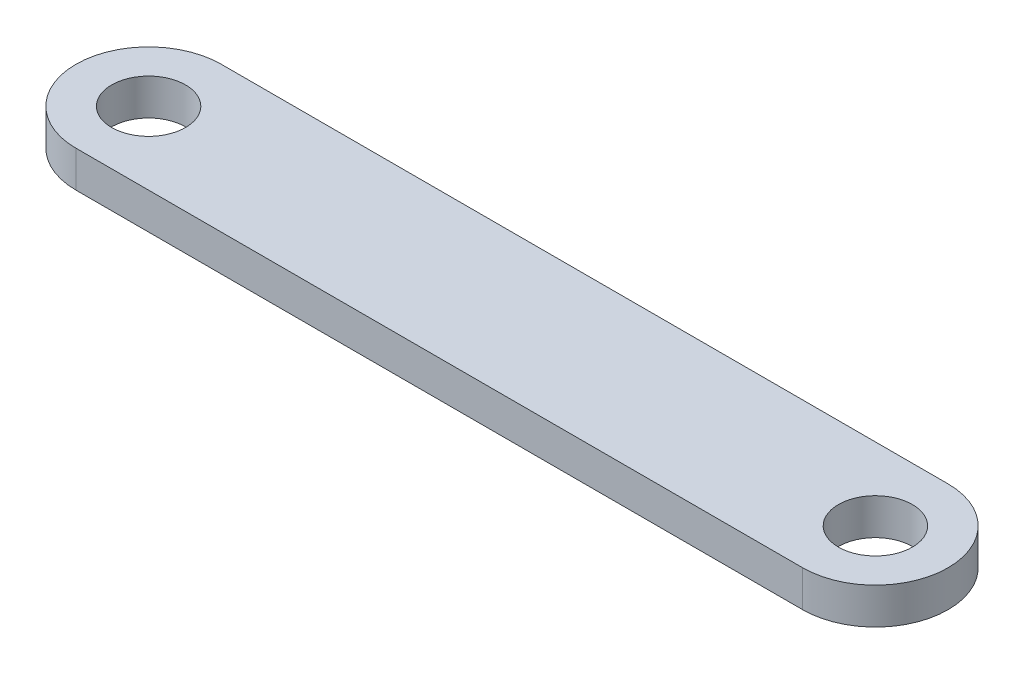
ISO-10303-21;
HEADER;
FILE_DESCRIPTION(('STEP AP214'),'2;1');
FILE_NAME('part.step','',(''),(''),'','','');
FILE_SCHEMA(('AUTOMOTIVE_DESIGN { 1 0 10303 214 1 1 1 1 }'));
ENDSEC;
DATA;
#1=APPLICATION_CONTEXT('core data for automotive mechanical design processes');
#2=APPLICATION_PROTOCOL_DEFINITION('international standard','automotive_design',2000,#1);
#3=PRODUCT_CONTEXT('',#1,'mechanical');
#4=PRODUCT('Part','Part','',(#3));
#5=PRODUCT_RELATED_PRODUCT_CATEGORY('part','',(#4));
#6=PRODUCT_DEFINITION_FORMATION('','',#4);
#7=PRODUCT_DEFINITION_CONTEXT('part definition',#1,'design');
#8=PRODUCT_DEFINITION('design','',#6,#7);
#9=PRODUCT_DEFINITION_SHAPE('','',#8);
#10=(LENGTH_UNIT() NAMED_UNIT(*) SI_UNIT(.MILLI.,.METRE.));
#11=(NAMED_UNIT(*) PLANE_ANGLE_UNIT() SI_UNIT($,.RADIAN.));
#12=(NAMED_UNIT(*) SI_UNIT($,.STERADIAN.) SOLID_ANGLE_UNIT());
#13=UNCERTAINTY_MEASURE_WITH_UNIT(LENGTH_MEASURE(1.E-05),#10,'distance_accuracy_value','');
#14=(GEOMETRIC_REPRESENTATION_CONTEXT(3) GLOBAL_UNCERTAINTY_ASSIGNED_CONTEXT((#13)) GLOBAL_UNIT_ASSIGNED_CONTEXT((#10,
#11,#12)) REPRESENTATION_CONTEXT('',''));
#15=CARTESIAN_POINT('',(0.,0.,0.));
#16=DIRECTION('',(0.,0.,1.));
#17=DIRECTION('',(1.,0.,0.));
#18=AXIS2_PLACEMENT_3D('',#15,#16,#17);
#19=CARTESIAN_POINT('',(0.,3.,0.));
#20=DIRECTION('',(0.,1.,0.));
#21=DIRECTION('',(0.,0.,1.));
#22=AXIS2_PLACEMENT_3D('',#19,#20,#21);
#23=PLANE('',#22);
#24=CARTESIAN_POINT('',(0.,3.,0.));
#25=DIRECTION('',(0.,1.,0.));
#26=DIRECTION('',(0.,0.,1.));
#27=AXIS2_PLACEMENT_3D('',#24,#25,#26);
#28=CIRCLE('',#27,3.05);
#29=CARTESIAN_POINT('',(0.,3.,3.05));
#30=VERTEX_POINT('',#29);
#31=EDGE_CURVE('E108',#30,#30,#28,.T.);
#32=ORIENTED_EDGE('',*,*,#31,.F.);
#33=EDGE_LOOP('',(#32));
#34=FACE_BOUND('',#33,.T.);
#35=CARTESIAN_POINT('',(0.,3.,0.));
#36=DIRECTION('',(0.,1.,0.));
#37=DIRECTION('',(0.,0.,1.));
#38=AXIS2_PLACEMENT_3D('',#35,#36,#37);
#39=CIRCLE('',#38,6.);
#40=CARTESIAN_POINT('',(0.,3.,-6.));
#41=VERTEX_POINT('',#40);
#42=CARTESIAN_POINT('',(0.,3.,6.));
#43=VERTEX_POINT('',#42);
#44=EDGE_CURVE('E93',#41,#43,#39,.T.);
#45=ORIENTED_EDGE('',*,*,#44,.T.);
#46=DIRECTION('',(1.,0.,0.));
#47=VECTOR('',#46,1.);
#48=CARTESIAN_POINT('',(0.,3.,6.));
#49=LINE('',#48,#47);
#50=CARTESIAN_POINT('',(60.,3.,6.));
#51=VERTEX_POINT('',#50);
#52=EDGE_CURVE('E88',#43,#51,#49,.T.);
#53=ORIENTED_EDGE('',*,*,#52,.T.);
#54=CARTESIAN_POINT('',(60.,3.,0.));
#55=DIRECTION('',(0.,1.,0.));
#56=DIRECTION('',(0.,0.,1.));
#57=AXIS2_PLACEMENT_3D('',#54,#55,#56);
#58=CIRCLE('',#57,6.);
#59=CARTESIAN_POINT('',(60.,3.,-6.));
#60=VERTEX_POINT('',#59);
#61=EDGE_CURVE('E91',#51,#60,#58,.T.);
#62=ORIENTED_EDGE('',*,*,#61,.T.);
#63=DIRECTION('',(-1.,0.,0.));
#64=VECTOR('',#63,1.);
#65=CARTESIAN_POINT('',(0.,3.,-6.));
#66=LINE('',#65,#64);
#67=EDGE_CURVE('E58',#60,#41,#66,.T.);
#68=ORIENTED_EDGE('',*,*,#67,.T.);
#69=EDGE_LOOP('',(#45,#53,#62,#68));
#70=FACE_BOUND('',#69,.T.);
#71=CARTESIAN_POINT('',(60.,3.,0.));
#72=DIRECTION('',(0.,1.,0.));
#73=DIRECTION('',(0.,0.,1.));
#74=AXIS2_PLACEMENT_3D('',#71,#72,#73);
#75=CIRCLE('',#74,3.04999999999999);
#76=CARTESIAN_POINT('',(60.,3.,3.04999999999999));
#77=VERTEX_POINT('',#76);
#78=EDGE_CURVE('E123',#77,#77,#75,.T.);
#79=ORIENTED_EDGE('',*,*,#78,.F.);
#80=EDGE_LOOP('',(#79));
#81=FACE_BOUND('',#80,.T.);
#82=ADVANCED_FACE('F41',(#34,#70,#81),#23,.T.);
#83=CARTESIAN_POINT('',(0.,0.,0.));
#84=DIRECTION('',(0.,1.,0.));
#85=DIRECTION('',(0.,0.,1.));
#86=AXIS2_PLACEMENT_3D('',#83,#84,#85);
#87=PLANE('',#86);
#88=CARTESIAN_POINT('',(0.,0.,0.));
#89=DIRECTION('',(0.,1.,0.));
#90=DIRECTION('',(0.,0.,1.));
#91=AXIS2_PLACEMENT_3D('',#88,#89,#90);
#92=CIRCLE('',#91,6.);
#93=CARTESIAN_POINT('',(0.,0.,-6.));
#94=VERTEX_POINT('',#93);
#95=CARTESIAN_POINT('',(0.,0.,6.));
#96=VERTEX_POINT('',#95);
#97=EDGE_CURVE('E105',#94,#96,#92,.T.);
#98=ORIENTED_EDGE('',*,*,#97,.F.);
#99=DIRECTION('',(-1.,0.,0.));
#100=VECTOR('',#99,1.);
#101=CARTESIAN_POINT('',(0.,0.,-6.));
#102=LINE('',#101,#100);
#103=CARTESIAN_POINT('',(60.,0.,-6.));
#104=VERTEX_POINT('',#103);
#105=EDGE_CURVE('E81',#104,#94,#102,.T.);
#106=ORIENTED_EDGE('',*,*,#105,.F.);
#107=CARTESIAN_POINT('',(60.,0.,0.));
#108=DIRECTION('',(0.,1.,0.));
#109=DIRECTION('',(0.,0.,1.));
#110=AXIS2_PLACEMENT_3D('',#107,#108,#109);
#111=CIRCLE('',#110,6.);
#112=CARTESIAN_POINT('',(60.,0.,6.));
#113=VERTEX_POINT('',#112);
#114=EDGE_CURVE('E75',#113,#104,#111,.T.);
#115=ORIENTED_EDGE('',*,*,#114,.F.);
#116=DIRECTION('',(1.,0.,0.));
#117=VECTOR('',#116,1.);
#118=CARTESIAN_POINT('',(0.,0.,6.));
#119=LINE('',#118,#117);
#120=EDGE_CURVE('E97',#96,#113,#119,.T.);
#121=ORIENTED_EDGE('',*,*,#120,.F.);
#122=EDGE_LOOP('',(#98,#106,#115,#121));
#123=FACE_BOUND('',#122,.T.);
#124=CARTESIAN_POINT('',(0.,0.,0.));
#125=DIRECTION('',(0.,1.,0.));
#126=DIRECTION('',(0.,0.,1.));
#127=AXIS2_PLACEMENT_3D('',#124,#125,#126);
#128=CIRCLE('',#127,3.05);
#129=CARTESIAN_POINT('',(0.,0.,3.05));
#130=VERTEX_POINT('',#129);
#131=EDGE_CURVE('E120',#130,#130,#128,.T.);
#132=ORIENTED_EDGE('',*,*,#131,.T.);
#133=EDGE_LOOP('',(#132));
#134=FACE_BOUND('',#133,.T.);
#135=CARTESIAN_POINT('',(60.,0.,0.));
#136=DIRECTION('',(0.,1.,0.));
#137=DIRECTION('',(0.,0.,1.));
#138=AXIS2_PLACEMENT_3D('',#135,#136,#137);
#139=CIRCLE('',#138,3.04999999999999);
#140=CARTESIAN_POINT('',(60.,0.,3.04999999999999));
#141=VERTEX_POINT('',#140);
#142=EDGE_CURVE('E126',#141,#141,#139,.T.);
#143=ORIENTED_EDGE('',*,*,#142,.T.);
#144=EDGE_LOOP('',(#143));
#145=FACE_BOUND('',#144,.T.);
#146=ADVANCED_FACE('F116',(#123,#134,#145),#87,.F.);
#147=CARTESIAN_POINT('',(0.,3.,0.));
#148=DIRECTION('',(0.,-1.,0.));
#149=DIRECTION('',(0.,0.,-1.));
#150=AXIS2_PLACEMENT_3D('',#147,#148,#149);
#151=CYLINDRICAL_SURFACE('',#150,6.);
#152=ORIENTED_EDGE('',*,*,#97,.T.);
#153=DIRECTION('',(0.,-1.,0.));
#154=VECTOR('',#153,1.);
#155=CARTESIAN_POINT('',(0.,3.,6.));
#156=LINE('',#155,#154);
#157=EDGE_CURVE('E11',#43,#96,#156,.T.);
#158=ORIENTED_EDGE('',*,*,#157,.F.);
#159=ORIENTED_EDGE('',*,*,#44,.F.);
#160=DIRECTION('',(0.,-1.,0.));
#161=VECTOR('',#160,1.);
#162=CARTESIAN_POINT('',(0.,3.,-6.));
#163=LINE('',#162,#161);
#164=EDGE_CURVE('E101',#41,#94,#163,.T.);
#165=ORIENTED_EDGE('',*,*,#164,.T.);
#166=EDGE_LOOP('',(#152,#158,#159,#165));
#167=FACE_BOUND('',#166,.T.);
#168=ADVANCED_FACE('F43',(#167),#151,.T.);
#169=CARTESIAN_POINT('',(0.,3.,6.));
#170=DIRECTION('',(0.,0.,-1.));
#171=DIRECTION('',(-1.,0.,0.));
#172=AXIS2_PLACEMENT_3D('',#169,#170,#171);
#173=PLANE('',#172);
#174=ORIENTED_EDGE('',*,*,#120,.T.);
#175=DIRECTION('',(0.,-1.,0.));
#176=VECTOR('',#175,1.);
#177=CARTESIAN_POINT('',(60.,3.,6.));
#178=LINE('',#177,#176);
#179=EDGE_CURVE('E50',#51,#113,#178,.T.);
#180=ORIENTED_EDGE('',*,*,#179,.F.);
#181=ORIENTED_EDGE('',*,*,#52,.F.);
#182=ORIENTED_EDGE('',*,*,#157,.T.);
#183=EDGE_LOOP('',(#174,#180,#181,#182));
#184=FACE_BOUND('',#183,.T.);
#185=ADVANCED_FACE('F96',(#184),#173,.F.);
#186=CARTESIAN_POINT('',(60.,3.,0.));
#187=DIRECTION('',(0.,-1.,0.));
#188=DIRECTION('',(0.,0.,-1.));
#189=AXIS2_PLACEMENT_3D('',#186,#187,#188);
#190=CYLINDRICAL_SURFACE('',#189,6.);
#191=ORIENTED_EDGE('',*,*,#114,.T.);
#192=DIRECTION('',(0.,-1.,0.));
#193=VECTOR('',#192,1.);
#194=CARTESIAN_POINT('',(60.,3.,-6.));
#195=LINE('',#194,#193);
#196=EDGE_CURVE('E98',#60,#104,#195,.T.);
#197=ORIENTED_EDGE('',*,*,#196,.F.);
#198=ORIENTED_EDGE('',*,*,#61,.F.);
#199=ORIENTED_EDGE('',*,*,#179,.T.);
#200=EDGE_LOOP('',(#191,#197,#198,#199));
#201=FACE_BOUND('',#200,.T.);
#202=ADVANCED_FACE('F99',(#201),#190,.T.);
#203=CARTESIAN_POINT('',(0.,3.,-6.));
#204=DIRECTION('',(0.,0.,1.));
#205=DIRECTION('',(1.,0.,0.));
#206=AXIS2_PLACEMENT_3D('',#203,#204,#205);
#207=PLANE('',#206);
#208=ORIENTED_EDGE('',*,*,#105,.T.);
#209=ORIENTED_EDGE('',*,*,#164,.F.);
#210=ORIENTED_EDGE('',*,*,#67,.F.);
#211=ORIENTED_EDGE('',*,*,#196,.T.);
#212=EDGE_LOOP('',(#208,#209,#210,#211));
#213=FACE_BOUND('',#212,.T.);
#214=ADVANCED_FACE('F113',(#213),#207,.F.);
#215=CARTESIAN_POINT('',(0.,3.,0.));
#216=DIRECTION('',(0.,-1.,0.));
#217=DIRECTION('',(0.,0.,-1.));
#218=AXIS2_PLACEMENT_3D('',#215,#216,#217);
#219=CYLINDRICAL_SURFACE('',#218,3.05);
#220=ORIENTED_EDGE('',*,*,#31,.T.);
#221=EDGE_LOOP('',(#220));
#222=FACE_BOUND('',#221,.T.);
#223=ORIENTED_EDGE('',*,*,#131,.F.);
#224=EDGE_LOOP('',(#223));
#225=FACE_BOUND('',#224,.T.);
#226=ADVANCED_FACE('F143',(#222,#225),#219,.F.);
#227=CARTESIAN_POINT('',(60.,3.,0.));
#228=DIRECTION('',(0.,-1.,0.));
#229=DIRECTION('',(0.,0.,-1.));
#230=AXIS2_PLACEMENT_3D('',#227,#228,#229);
#231=CYLINDRICAL_SURFACE('',#230,3.04999999999999);
#232=ORIENTED_EDGE('',*,*,#78,.T.);
#233=EDGE_LOOP('',(#232));
#234=FACE_BOUND('',#233,.T.);
#235=ORIENTED_EDGE('',*,*,#142,.F.);
#236=EDGE_LOOP('',(#235));
#237=FACE_BOUND('',#236,.T.);
#238=ADVANCED_FACE('F132',(#234,#237),#231,.F.);
#239=CLOSED_SHELL('',(#82,#146,#168,#185,#202,#214,#226,#238));
#240=MANIFOLD_SOLID_BREP('B2',#239);
#241=ADVANCED_BREP_SHAPE_REPRESENTATION('',(#18,#240),#14);
#242=SHAPE_DEFINITION_REPRESENTATION(#9,#241);
ENDSEC;
END-ISO-10303-21;
